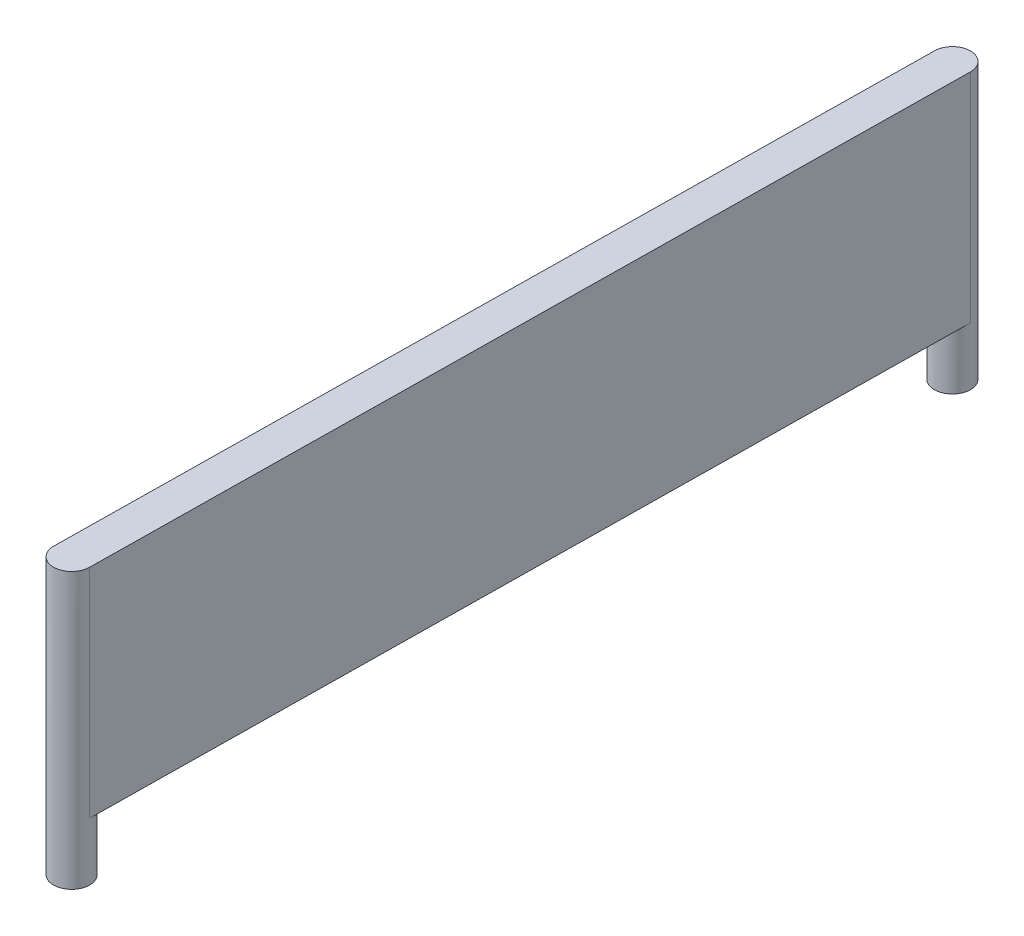
ISO-10303-21;
HEADER;
FILE_DESCRIPTION(('STEP AP214'),'2;1');
FILE_NAME('part.step','',(''),(''),'','','');
FILE_SCHEMA(('AUTOMOTIVE_DESIGN { 1 0 10303 214 1 1 1 1 }'));
ENDSEC;
DATA;
#1=APPLICATION_CONTEXT('core data for automotive mechanical design processes');
#2=APPLICATION_PROTOCOL_DEFINITION('international standard','automotive_design',2000,#1);
#3=PRODUCT_CONTEXT('',#1,'mechanical');
#4=PRODUCT('Part','Part','',(#3));
#5=PRODUCT_RELATED_PRODUCT_CATEGORY('part','',(#4));
#6=PRODUCT_DEFINITION_FORMATION('','',#4);
#7=PRODUCT_DEFINITION_CONTEXT('part definition',#1,'design');
#8=PRODUCT_DEFINITION('design','',#6,#7);
#9=PRODUCT_DEFINITION_SHAPE('','',#8);
#10=(LENGTH_UNIT() NAMED_UNIT(*) SI_UNIT(.MILLI.,.METRE.));
#11=(NAMED_UNIT(*) PLANE_ANGLE_UNIT() SI_UNIT($,.RADIAN.));
#12=(NAMED_UNIT(*) SI_UNIT($,.STERADIAN.) SOLID_ANGLE_UNIT());
#13=UNCERTAINTY_MEASURE_WITH_UNIT(LENGTH_MEASURE(1.E-05),#10,'distance_accuracy_value','');
#14=(GEOMETRIC_REPRESENTATION_CONTEXT(3) GLOBAL_UNCERTAINTY_ASSIGNED_CONTEXT((#13)) GLOBAL_UNIT_ASSIGNED_CONTEXT((#10,
#11,#12)) REPRESENTATION_CONTEXT('',''));
#15=CARTESIAN_POINT('',(0.,0.,0.));
#16=DIRECTION('',(0.,0.,1.));
#17=DIRECTION('',(1.,0.,0.));
#18=AXIS2_PLACEMENT_3D('',#15,#16,#17);
#19=CARTESIAN_POINT('',(0.,0.,0.));
#20=DIRECTION('',(0.,1.,0.));
#21=DIRECTION('',(0.,0.,1.));
#22=AXIS2_PLACEMENT_3D('',#19,#20,#21);
#23=PLANE('',#22);
#24=CARTESIAN_POINT('',(0.,0.,0.));
#25=DIRECTION('',(0.,-1.,0.));
#26=DIRECTION('',(0.,0.,-1.));
#27=AXIS2_PLACEMENT_3D('',#24,#25,#26);
#28=CIRCLE('',#27,3.175);
#29=CARTESIAN_POINT('',(-3.17472592193033,0.,-0.0417171502336675));
#30=VERTEX_POINT('',#29);
#31=CARTESIAN_POINT('',(3.17472592193033,0.,0.0417171502336674));
#32=VERTEX_POINT('',#31);
#33=EDGE_CURVE('E69',#30,#32,#28,.T.);
#34=ORIENTED_EDGE('',*,*,#33,.F.);
#35=DIRECTION('',(-0.0131392599161157,0.,0.999913676198529));
#36=VECTOR('',#35,1.);
#37=CARTESIAN_POINT('',(-3.17472592193033,0.,-0.0417171502336674));
#38=LINE('',#37,#36);
#39=CARTESIAN_POINT('',(-1.1721298390076,0.,-152.441717150234));
#40=VERTEX_POINT('',#39);
#41=EDGE_CURVE('E113',#40,#30,#38,.T.);
#42=ORIENTED_EDGE('',*,*,#41,.F.);
#43=CARTESIAN_POINT('',(2.00259608292273,0.,-152.4));
#44=DIRECTION('',(0.,-1.,0.));
#45=DIRECTION('',(0.,0.,-1.));
#46=AXIS2_PLACEMENT_3D('',#43,#44,#45);
#47=CIRCLE('',#46,3.175);
#48=CARTESIAN_POINT('',(5.17732200485305,0.,-152.358282849766));
#49=VERTEX_POINT('',#48);
#50=EDGE_CURVE('E78',#49,#40,#47,.T.);
#51=ORIENTED_EDGE('',*,*,#50,.F.);
#52=DIRECTION('',(0.0131392599161157,0.,-0.999913676198529));
#53=VECTOR('',#52,1.);
#54=CARTESIAN_POINT('',(3.17472592193033,0.,0.0417171502336674));
#55=LINE('',#54,#53);
#56=EDGE_CURVE('E97',#32,#49,#55,.T.);
#57=ORIENTED_EDGE('',*,*,#56,.F.);
#58=EDGE_LOOP('',(#34,#42,#51,#57));
#59=FACE_BOUND('',#58,.T.);
#60=ADVANCED_FACE('F39',(#59),#23,.F.);
#61=CARTESIAN_POINT('',(0.,38.1,0.));
#62=DIRECTION('',(0.,-1.,0.));
#63=DIRECTION('',(0.,0.,-1.));
#64=AXIS2_PLACEMENT_3D('',#61,#62,#63);
#65=CYLINDRICAL_SURFACE('',#64,3.175);
#66=DIRECTION('',(0.,-1.,0.));
#67=VECTOR('',#66,1.);
#68=CARTESIAN_POINT('',(-3.17472592193033,38.1,-0.0417171502336674));
#69=LINE('',#68,#67);
#70=CARTESIAN_POINT('',(-3.17472592193033,38.1,-0.0417171502336674));
#71=VERTEX_POINT('',#70);
#72=EDGE_CURVE('E107',#71,#30,#69,.T.);
#73=ORIENTED_EDGE('',*,*,#72,.T.);
#74=ORIENTED_EDGE('',*,*,#33,.T.);
#75=DIRECTION('',(0.,-1.,0.));
#76=VECTOR('',#75,1.);
#77=CARTESIAN_POINT('',(3.17472592193033,38.1,0.0417171502336674));
#78=LINE('',#77,#76);
#79=CARTESIAN_POINT('',(3.17472592193033,38.1,0.0417171502336674));
#80=VERTEX_POINT('',#79);
#81=EDGE_CURVE('E11',#80,#32,#78,.T.);
#82=ORIENTED_EDGE('',*,*,#81,.F.);
#83=CARTESIAN_POINT('',(0.,38.1,0.));
#84=DIRECTION('',(0.,1.,0.));
#85=DIRECTION('',(0.,0.,1.));
#86=AXIS2_PLACEMENT_3D('',#83,#84,#85);
#87=CIRCLE('',#86,3.175);
#88=EDGE_CURVE('E91',#71,#80,#87,.T.);
#89=ORIENTED_EDGE('',*,*,#88,.F.);
#90=EDGE_LOOP('',(#73,#74,#82,#89));
#91=FACE_BOUND('',#90,.T.);
#92=CARTESIAN_POINT('',(0.,-10.16,0.));
#93=DIRECTION('',(0.,-1.,0.));
#94=DIRECTION('',(0.,0.,-1.));
#95=AXIS2_PLACEMENT_3D('',#92,#93,#94);
#96=CIRCLE('',#95,3.175);
#97=CARTESIAN_POINT('',(0.,-10.16,-3.175));
#98=VERTEX_POINT('',#97);
#99=EDGE_CURVE('E124',#98,#98,#96,.T.);
#100=ORIENTED_EDGE('',*,*,#99,.F.);
#101=EDGE_LOOP('',(#100));
#102=FACE_BOUND('',#101,.T.);
#103=ADVANCED_FACE('F41',(#91,#102),#65,.T.);
#104=CARTESIAN_POINT('',(3.17472592193033,38.1,0.0417171502336674));
#105=DIRECTION('',(-0.999913676198529,0.,-0.0131392599161157));
#106=DIRECTION('',(-0.0131392599161157,0.,0.999913676198529));
#107=AXIS2_PLACEMENT_3D('',#104,#105,#106);
#108=PLANE('',#107);
#109=ORIENTED_EDGE('',*,*,#56,.T.);
#110=DIRECTION('',(0.,-1.,0.));
#111=VECTOR('',#110,1.);
#112=CARTESIAN_POINT('',(5.17732200485306,38.1,-152.358282849766));
#113=LINE('',#112,#111);
#114=CARTESIAN_POINT('',(5.17732200485306,38.1,-152.358282849766));
#115=VERTEX_POINT('',#114);
#116=EDGE_CURVE('E49',#115,#49,#113,.T.);
#117=ORIENTED_EDGE('',*,*,#116,.F.);
#118=DIRECTION('',(0.0131392599161157,0.,-0.999913676198529));
#119=VECTOR('',#118,1.);
#120=CARTESIAN_POINT('',(3.17472592193033,38.1,0.0417171502336674));
#121=LINE('',#120,#119);
#122=EDGE_CURVE('E84',#80,#115,#121,.T.);
#123=ORIENTED_EDGE('',*,*,#122,.F.);
#124=ORIENTED_EDGE('',*,*,#81,.T.);
#125=EDGE_LOOP('',(#109,#117,#123,#124));
#126=FACE_BOUND('',#125,.T.);
#127=ADVANCED_FACE('F96',(#126),#108,.F.);
#128=CARTESIAN_POINT('',(2.00259608292273,38.1,-152.4));
#129=DIRECTION('',(0.,-1.,0.));
#130=DIRECTION('',(0.,0.,-1.));
#131=AXIS2_PLACEMENT_3D('',#128,#129,#130);
#132=CYLINDRICAL_SURFACE('',#131,3.175);
#133=ORIENTED_EDGE('',*,*,#116,.T.);
#134=ORIENTED_EDGE('',*,*,#50,.T.);
#135=DIRECTION('',(0.,-1.,0.));
#136=VECTOR('',#135,1.);
#137=CARTESIAN_POINT('',(-1.1721298390076,38.1,-152.441717150234));
#138=LINE('',#137,#136);
#139=CARTESIAN_POINT('',(-1.1721298390076,38.1,-152.441717150234));
#140=VERTEX_POINT('',#139);
#141=EDGE_CURVE('E100',#140,#40,#138,.T.);
#142=ORIENTED_EDGE('',*,*,#141,.F.);
#143=CARTESIAN_POINT('',(2.00259608292273,38.1,-152.4));
#144=DIRECTION('',(0.,1.,0.));
#145=DIRECTION('',(0.,0.,1.));
#146=AXIS2_PLACEMENT_3D('',#143,#144,#145);
#147=CIRCLE('',#146,3.175);
#148=EDGE_CURVE('E88',#115,#140,#147,.T.);
#149=ORIENTED_EDGE('',*,*,#148,.F.);
#150=EDGE_LOOP('',(#133,#134,#142,#149));
#151=FACE_BOUND('',#150,.T.);
#152=CARTESIAN_POINT('',(2.00259608292273,-10.16,-152.4));
#153=DIRECTION('',(0.,-1.,0.));
#154=DIRECTION('',(0.,0.,-1.));
#155=AXIS2_PLACEMENT_3D('',#152,#153,#154);
#156=CIRCLE('',#155,3.175);
#157=CARTESIAN_POINT('',(2.00259608292273,-10.16,-155.575));
#158=VERTEX_POINT('',#157);
#159=EDGE_CURVE('E114',#158,#158,#156,.T.);
#160=ORIENTED_EDGE('',*,*,#159,.F.);
#161=EDGE_LOOP('',(#160));
#162=FACE_BOUND('',#161,.T.);
#163=ADVANCED_FACE('F101',(#151,#162),#132,.T.);
#164=CARTESIAN_POINT('',(-3.17472592193033,38.1,-0.0417171502336674));
#165=DIRECTION('',(0.999913676198529,0.,0.0131392599161157));
#166=DIRECTION('',(0.0131392599161157,0.,-0.999913676198529));
#167=AXIS2_PLACEMENT_3D('',#164,#165,#166);
#168=PLANE('',#167);
#169=ORIENTED_EDGE('',*,*,#41,.T.);
#170=ORIENTED_EDGE('',*,*,#72,.F.);
#171=DIRECTION('',(-0.0131392599161157,0.,0.999913676198529));
#172=VECTOR('',#171,1.);
#173=CARTESIAN_POINT('',(-3.17472592193033,38.1,-0.0417171502336674));
#174=LINE('',#173,#172);
#175=EDGE_CURVE('E57',#140,#71,#174,.T.);
#176=ORIENTED_EDGE('',*,*,#175,.F.);
#177=ORIENTED_EDGE('',*,*,#141,.T.);
#178=EDGE_LOOP('',(#169,#170,#176,#177));
#179=FACE_BOUND('',#178,.T.);
#180=ADVANCED_FACE('F122',(#179),#168,.F.);
#181=CARTESIAN_POINT('',(0.,38.1,0.));
#182=DIRECTION('',(0.,1.,0.));
#183=DIRECTION('',(0.,0.,1.));
#184=AXIS2_PLACEMENT_3D('',#181,#182,#183);
#185=PLANE('',#184);
#186=ORIENTED_EDGE('',*,*,#88,.T.);
#187=ORIENTED_EDGE('',*,*,#122,.T.);
#188=ORIENTED_EDGE('',*,*,#148,.T.);
#189=ORIENTED_EDGE('',*,*,#175,.T.);
#190=EDGE_LOOP('',(#186,#187,#188,#189));
#191=FACE_BOUND('',#190,.T.);
#192=ADVANCED_FACE('F86',(#191),#185,.T.);
#193=CARTESIAN_POINT('',(2.00259608292273,-10.16,-152.4));
#194=DIRECTION('',(0.,-1.,0.));
#195=DIRECTION('',(0.,0.,-1.));
#196=AXIS2_PLACEMENT_3D('',#193,#194,#195);
#197=PLANE('',#196);
#198=ORIENTED_EDGE('',*,*,#159,.T.);
#199=EDGE_LOOP('',(#198));
#200=FACE_BOUND('',#199,.T.);
#201=ADVANCED_FACE('F137',(#200),#197,.T.);
#202=CARTESIAN_POINT('',(0.,-10.16,0.));
#203=DIRECTION('',(0.,-1.,0.));
#204=DIRECTION('',(0.,0.,-1.));
#205=AXIS2_PLACEMENT_3D('',#202,#203,#204);
#206=PLANE('',#205);
#207=ORIENTED_EDGE('',*,*,#99,.T.);
#208=EDGE_LOOP('',(#207));
#209=FACE_BOUND('',#208,.T.);
#210=ADVANCED_FACE('F155',(#209),#206,.T.);
#211=CLOSED_SHELL('',(#60,#103,#127,#163,#180,#192,#201,#210));
#212=MANIFOLD_SOLID_BREP('B2',#211);
#213=ADVANCED_BREP_SHAPE_REPRESENTATION('',(#18,#212),#14);
#214=SHAPE_DEFINITION_REPRESENTATION(#9,#213);
ENDSEC;
END-ISO-10303-21;
